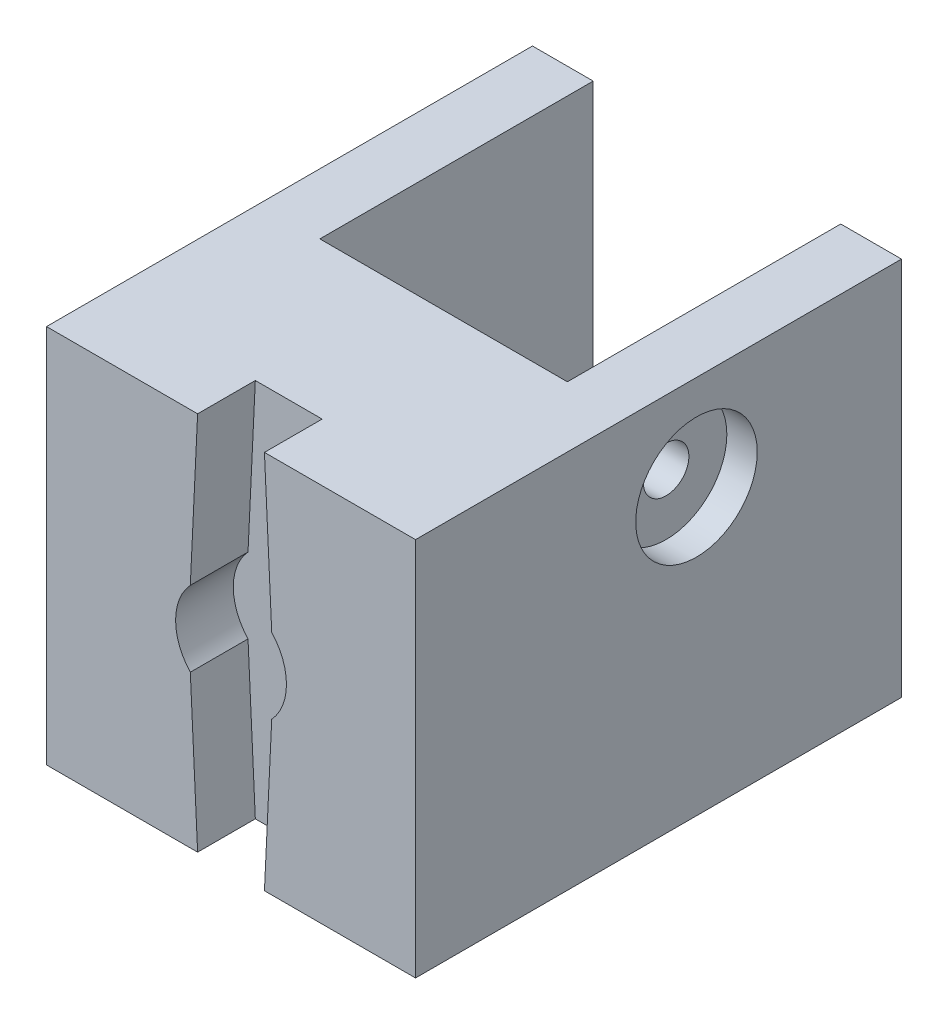
ISO-10303-21;
HEADER;
FILE_DESCRIPTION(('STEP AP214'),'2;1');
FILE_NAME('part.step','',(''),(''),'','','');
FILE_SCHEMA(('AUTOMOTIVE_DESIGN { 1 0 10303 214 1 1 1 1 }'));
ENDSEC;
DATA;
#1=APPLICATION_CONTEXT('core data for automotive mechanical design processes');
#2=APPLICATION_PROTOCOL_DEFINITION('international standard','automotive_design',2000,#1);
#3=PRODUCT_CONTEXT('',#1,'mechanical');
#4=PRODUCT('Part','Part','',(#3));
#5=PRODUCT_RELATED_PRODUCT_CATEGORY('part','',(#4));
#6=PRODUCT_DEFINITION_FORMATION('','',#4);
#7=PRODUCT_DEFINITION_CONTEXT('part definition',#1,'design');
#8=PRODUCT_DEFINITION('design','',#6,#7);
#9=PRODUCT_DEFINITION_SHAPE('','',#8);
#10=(LENGTH_UNIT() NAMED_UNIT(*) SI_UNIT(.MILLI.,.METRE.));
#11=(NAMED_UNIT(*) PLANE_ANGLE_UNIT() SI_UNIT($,.RADIAN.));
#12=(NAMED_UNIT(*) SI_UNIT($,.STERADIAN.) SOLID_ANGLE_UNIT());
#13=UNCERTAINTY_MEASURE_WITH_UNIT(LENGTH_MEASURE(1.E-05),#10,'distance_accuracy_value','');
#14=(GEOMETRIC_REPRESENTATION_CONTEXT(3) GLOBAL_UNCERTAINTY_ASSIGNED_CONTEXT((#13)) GLOBAL_UNIT_ASSIGNED_CONTEXT((#10,
#11,#12)) REPRESENTATION_CONTEXT('',''));
#15=CARTESIAN_POINT('',(0.,0.,0.));
#16=DIRECTION('',(0.,0.,1.));
#17=DIRECTION('',(1.,0.,0.));
#18=AXIS2_PLACEMENT_3D('',#15,#16,#17);
#19=CARTESIAN_POINT('',(-12.15,6.25,-13.5));
#20=DIRECTION('',(1.,0.,0.));
#21=DIRECTION('',(0.,0.,-1.));
#22=AXIS2_PLACEMENT_3D('',#19,#20,#21);
#23=CYLINDRICAL_SURFACE('',#22,1.5);
#24=CARTESIAN_POINT('',(-8.15000000000001,6.25,-13.5));
#25=DIRECTION('',(1.,0.,0.));
#26=DIRECTION('',(0.,0.,-1.));
#27=AXIS2_PLACEMENT_3D('',#24,#25,#26);
#28=CIRCLE('',#27,1.5);
#29=CARTESIAN_POINT('',(-8.15000000000001,6.25,-15.));
#30=VERTEX_POINT('',#29);
#31=EDGE_CURVE('E191',#30,#30,#28,.T.);
#32=ORIENTED_EDGE('',*,*,#31,.T.);
#33=EDGE_LOOP('',(#32));
#34=FACE_BOUND('',#33,.T.);
#35=CARTESIAN_POINT('',(-10.15,6.25,-13.5));
#36=DIRECTION('',(-1.,0.,0.));
#37=DIRECTION('',(0.,0.,1.));
#38=AXIS2_PLACEMENT_3D('',#35,#36,#37);
#39=CIRCLE('',#38,1.5);
#40=CARTESIAN_POINT('',(-10.15,6.25,-12.));
#41=VERTEX_POINT('',#40);
#42=EDGE_CURVE('E43',#41,#41,#39,.F.);
#43=ORIENTED_EDGE('',*,*,#42,.F.);
#44=EDGE_LOOP('',(#43));
#45=FACE_BOUND('',#44,.T.);
#46=ADVANCED_FACE('F39',(#34,#45),#23,.F.);
#47=CARTESIAN_POINT('',(12.15,18.75,-4.5));
#48=DIRECTION('',(-1.,0.,0.));
#49=DIRECTION('',(0.,0.,1.));
#50=AXIS2_PLACEMENT_3D('',#47,#48,#49);
#51=CYLINDRICAL_SURFACE('',#50,1.5);
#52=CARTESIAN_POINT('',(8.15,18.75,-4.5));
#53=DIRECTION('',(-1.,0.,0.));
#54=DIRECTION('',(0.,0.,1.));
#55=AXIS2_PLACEMENT_3D('',#52,#53,#54);
#56=CIRCLE('',#55,1.5);
#57=CARTESIAN_POINT('',(8.15,18.75,-3.));
#58=VERTEX_POINT('',#57);
#59=EDGE_CURVE('E198',#58,#58,#56,.T.);
#60=ORIENTED_EDGE('',*,*,#59,.T.);
#61=EDGE_LOOP('',(#60));
#62=FACE_BOUND('',#61,.T.);
#63=CARTESIAN_POINT('',(10.15,18.75,-4.5));
#64=DIRECTION('',(1.,0.,0.));
#65=DIRECTION('',(0.,0.,-1.));
#66=AXIS2_PLACEMENT_3D('',#63,#64,#65);
#67=CIRCLE('',#66,1.5);
#68=CARTESIAN_POINT('',(10.15,18.75,-5.99999999999999));
#69=VERTEX_POINT('',#68);
#70=EDGE_CURVE('E188',#69,#69,#67,.F.);
#71=ORIENTED_EDGE('',*,*,#70,.F.);
#72=EDGE_LOOP('',(#71));
#73=FACE_BOUND('',#72,.T.);
#74=ADVANCED_FACE('F411',(#62,#73),#51,.F.);
#75=CARTESIAN_POINT('',(0.,0.,14.));
#76=DIRECTION('',(0.,0.,1.));
#77=DIRECTION('',(1.,0.,0.));
#78=AXIS2_PLACEMENT_3D('',#75,#76,#77);
#79=PLANE('',#78);
#80=CARTESIAN_POINT('',(0.,12.5,14.));
#81=DIRECTION('',(0.,0.,1.));
#82=DIRECTION('',(1.,0.,0.));
#83=AXIS2_PLACEMENT_3D('',#80,#81,#82);
#84=CIRCLE('',#83,3.65);
#85=CARTESIAN_POINT('',(2.68111777409015,10.0232869602116,14.));
#86=VERTEX_POINT('',#85);
#87=CARTESIAN_POINT('',(2.68111777409015,14.9767130397884,14.));
#88=VERTEX_POINT('',#87);
#89=EDGE_CURVE('E215',#86,#88,#84,.T.);
#90=ORIENTED_EDGE('',*,*,#89,.F.);
#91=DIRECTION('',(0.0479447993683979,0.99884998684163,0.));
#92=VECTOR('',#91,1.);
#93=CARTESIAN_POINT('',(2.2,0.,14.));
#94=LINE('',#93,#92);
#95=CARTESIAN_POINT('',(2.2,0.,14.));
#96=VERTEX_POINT('',#95);
#97=EDGE_CURVE('E261',#96,#86,#94,.T.);
#98=ORIENTED_EDGE('',*,*,#97,.F.);
#99=DIRECTION('',(1.,0.,0.));
#100=VECTOR('',#99,1.);
#101=CARTESIAN_POINT('',(-12.15,0.,14.));
#102=LINE('',#101,#100);
#103=CARTESIAN_POINT('',(12.15,0.,14.));
#104=VERTEX_POINT('',#103);
#105=EDGE_CURVE('E289',#96,#104,#102,.T.);
#106=ORIENTED_EDGE('',*,*,#105,.T.);
#107=DIRECTION('',(0.,1.,0.));
#108=VECTOR('',#107,1.);
#109=CARTESIAN_POINT('',(12.15,0.,14.));
#110=LINE('',#109,#108);
#111=CARTESIAN_POINT('',(12.15,25.,14.));
#112=VERTEX_POINT('',#111);
#113=EDGE_CURVE('E294',#104,#112,#110,.T.);
#114=ORIENTED_EDGE('',*,*,#113,.T.);
#115=DIRECTION('',(-1.,0.,0.));
#116=VECTOR('',#115,1.);
#117=CARTESIAN_POINT('',(12.15,25.,14.));
#118=LINE('',#117,#116);
#119=CARTESIAN_POINT('',(2.2,25.,14.));
#120=VERTEX_POINT('',#119);
#121=EDGE_CURVE('E154',#112,#120,#118,.T.);
#122=ORIENTED_EDGE('',*,*,#121,.T.);
#123=DIRECTION('',(-0.0479447993683979,0.99884998684163,0.));
#124=VECTOR('',#123,1.);
#125=CARTESIAN_POINT('',(2.2,25.,14.));
#126=LINE('',#125,#124);
#127=EDGE_CURVE('E243',#88,#120,#126,.T.);
#128=ORIENTED_EDGE('',*,*,#127,.F.);
#129=EDGE_LOOP('',(#90,#98,#106,#114,#122,#128));
#130=FACE_BOUND('',#129,.T.);
#131=ADVANCED_FACE('F342',(#130),#79,.T.);
#132=CARTESIAN_POINT('',(12.15,25.,0.));
#133=DIRECTION('',(-1.,0.,0.));
#134=DIRECTION('',(0.,0.,1.));
#135=AXIS2_PLACEMENT_3D('',#132,#133,#134);
#136=PLANE('',#135);
#137=CARTESIAN_POINT('',(12.15,18.75,-4.5));
#138=DIRECTION('',(1.,0.,0.));
#139=DIRECTION('',(0.,0.,-1.));
#140=AXIS2_PLACEMENT_3D('',#137,#138,#139);
#141=CIRCLE('',#140,4.);
#142=CARTESIAN_POINT('',(12.15,18.75,-8.5));
#143=VERTEX_POINT('',#142);
#144=EDGE_CURVE('E201',#143,#143,#141,.T.);
#145=ORIENTED_EDGE('',*,*,#144,.F.);
#146=EDGE_LOOP('',(#145));
#147=FACE_BOUND('',#146,.T.);
#148=DIRECTION('',(0.,0.,-1.));
#149=VECTOR('',#148,1.);
#150=CARTESIAN_POINT('',(12.15,0.,0.));
#151=LINE('',#150,#149);
#152=CARTESIAN_POINT('',(12.15,0.,-18.));
#153=VERTEX_POINT('',#152);
#154=EDGE_CURVE('E149',#104,#153,#151,.T.);
#155=ORIENTED_EDGE('',*,*,#154,.T.);
#156=DIRECTION('',(0.,-1.,0.));
#157=VECTOR('',#156,1.);
#158=CARTESIAN_POINT('',(12.15,25.,-18.));
#159=LINE('',#158,#157);
#160=CARTESIAN_POINT('',(12.15,25.,-18.));
#161=VERTEX_POINT('',#160);
#162=EDGE_CURVE('E183',#161,#153,#159,.T.);
#163=ORIENTED_EDGE('',*,*,#162,.F.);
#164=DIRECTION('',(0.,0.,-1.));
#165=VECTOR('',#164,1.);
#166=CARTESIAN_POINT('',(12.15,25.,0.));
#167=LINE('',#166,#165);
#168=EDGE_CURVE('E100',#112,#161,#167,.T.);
#169=ORIENTED_EDGE('',*,*,#168,.F.);
#170=ORIENTED_EDGE('',*,*,#113,.F.);
#171=EDGE_LOOP('',(#155,#163,#169,#170));
#172=FACE_BOUND('',#171,.T.);
#173=ADVANCED_FACE('F41',(#147,#172),#136,.F.);
#174=CARTESIAN_POINT('',(8.15,25.,-18.));
#175=DIRECTION('',(0.,0.,-1.));
#176=DIRECTION('',(-1.,0.,0.));
#177=AXIS2_PLACEMENT_3D('',#174,#175,#176);
#178=PLANE('',#177);
#179=DIRECTION('',(1.,0.,0.));
#180=VECTOR('',#179,1.);
#181=CARTESIAN_POINT('',(8.15,0.,-18.));
#182=LINE('',#181,#180);
#183=CARTESIAN_POINT('',(8.15,0.,-18.));
#184=VERTEX_POINT('',#183);
#185=EDGE_CURVE('E153',#184,#153,#182,.T.);
#186=ORIENTED_EDGE('',*,*,#185,.F.);
#187=DIRECTION('',(0.,-1.,0.));
#188=VECTOR('',#187,1.);
#189=CARTESIAN_POINT('',(8.15,25.,-18.));
#190=LINE('',#189,#188);
#191=CARTESIAN_POINT('',(8.15,25.,-18.));
#192=VERTEX_POINT('',#191);
#193=EDGE_CURVE('E180',#192,#184,#190,.T.);
#194=ORIENTED_EDGE('',*,*,#193,.F.);
#195=DIRECTION('',(1.,0.,0.));
#196=VECTOR('',#195,1.);
#197=CARTESIAN_POINT('',(8.15,25.,-18.));
#198=LINE('',#197,#196);
#199=EDGE_CURVE('E304',#192,#161,#198,.T.);
#200=ORIENTED_EDGE('',*,*,#199,.T.);
#201=ORIENTED_EDGE('',*,*,#162,.T.);
#202=EDGE_LOOP('',(#186,#194,#200,#201));
#203=FACE_BOUND('',#202,.T.);
#204=ADVANCED_FACE('F467',(#203),#178,.T.);
#205=CARTESIAN_POINT('',(8.15,25.,0.));
#206=DIRECTION('',(-1.,0.,0.));
#207=DIRECTION('',(0.,0.,1.));
#208=AXIS2_PLACEMENT_3D('',#205,#206,#207);
#209=PLANE('',#208);
#210=ORIENTED_EDGE('',*,*,#59,.F.);
#211=EDGE_LOOP('',(#210));
#212=FACE_BOUND('',#211,.T.);
#213=DIRECTION('',(0.,0.,-1.));
#214=VECTOR('',#213,1.);
#215=CARTESIAN_POINT('',(8.15,0.,0.));
#216=LINE('',#215,#214);
#217=CARTESIAN_POINT('',(8.15,0.,0.));
#218=VERTEX_POINT('',#217);
#219=EDGE_CURVE('E158',#218,#184,#216,.T.);
#220=ORIENTED_EDGE('',*,*,#219,.F.);
#221=DIRECTION('',(0.,-1.,0.));
#222=VECTOR('',#221,1.);
#223=CARTESIAN_POINT('',(8.15,25.,0.));
#224=LINE('',#223,#222);
#225=CARTESIAN_POINT('',(8.15,25.,0.));
#226=VERTEX_POINT('',#225);
#227=EDGE_CURVE('E124',#226,#218,#224,.T.);
#228=ORIENTED_EDGE('',*,*,#227,.F.);
#229=DIRECTION('',(0.,0.,-1.));
#230=VECTOR('',#229,1.);
#231=CARTESIAN_POINT('',(8.15,25.,0.));
#232=LINE('',#231,#230);
#233=EDGE_CURVE('E134',#226,#192,#232,.T.);
#234=ORIENTED_EDGE('',*,*,#233,.T.);
#235=ORIENTED_EDGE('',*,*,#193,.T.);
#236=EDGE_LOOP('',(#220,#228,#234,#235));
#237=FACE_BOUND('',#236,.T.);
#238=ADVANCED_FACE('F310',(#212,#237),#209,.T.);
#239=CARTESIAN_POINT('',(-8.15,25.,0.));
#240=DIRECTION('',(0.,0.,-1.));
#241=DIRECTION('',(-1.,0.,0.));
#242=AXIS2_PLACEMENT_3D('',#239,#240,#241);
#243=PLANE('',#242);
#244=DIRECTION('',(1.,0.,0.));
#245=VECTOR('',#244,1.);
#246=CARTESIAN_POINT('',(-8.15,0.,0.));
#247=LINE('',#246,#245);
#248=CARTESIAN_POINT('',(-8.15,0.,0.));
#249=VERTEX_POINT('',#248);
#250=EDGE_CURVE('E118',#249,#218,#247,.T.);
#251=ORIENTED_EDGE('',*,*,#250,.F.);
#252=DIRECTION('',(0.,-1.,0.));
#253=VECTOR('',#252,1.);
#254=CARTESIAN_POINT('',(-8.15,25.,0.));
#255=LINE('',#254,#253);
#256=CARTESIAN_POINT('',(-8.15,25.,0.));
#257=VERTEX_POINT('',#256);
#258=EDGE_CURVE('E113',#257,#249,#255,.T.);
#259=ORIENTED_EDGE('',*,*,#258,.F.);
#260=DIRECTION('',(1.,0.,0.));
#261=VECTOR('',#260,1.);
#262=CARTESIAN_POINT('',(-8.15,25.,0.));
#263=LINE('',#262,#261);
#264=EDGE_CURVE('E116',#257,#226,#263,.T.);
#265=ORIENTED_EDGE('',*,*,#264,.T.);
#266=ORIENTED_EDGE('',*,*,#227,.T.);
#267=EDGE_LOOP('',(#251,#259,#265,#266));
#268=FACE_BOUND('',#267,.T.);
#269=ADVANCED_FACE('F115',(#268),#243,.T.);
#270=CARTESIAN_POINT('',(-8.15000000000001,25.,-18.));
#271=DIRECTION('',(1.,0.,0.));
#272=DIRECTION('',(0.,0.,-1.));
#273=AXIS2_PLACEMENT_3D('',#270,#271,#272);
#274=PLANE('',#273);
#275=ORIENTED_EDGE('',*,*,#31,.F.);
#276=EDGE_LOOP('',(#275));
#277=FACE_BOUND('',#276,.T.);
#278=DIRECTION('',(0.,0.,1.));
#279=VECTOR('',#278,1.);
#280=CARTESIAN_POINT('',(-8.15000000000001,0.,-18.));
#281=LINE('',#280,#279);
#282=CARTESIAN_POINT('',(-8.15000000000001,0.,-18.));
#283=VERTEX_POINT('',#282);
#284=EDGE_CURVE('E164',#283,#249,#281,.T.);
#285=ORIENTED_EDGE('',*,*,#284,.F.);
#286=DIRECTION('',(0.,-1.,0.));
#287=VECTOR('',#286,1.);
#288=CARTESIAN_POINT('',(-8.15000000000001,25.,-18.));
#289=LINE('',#288,#287);
#290=CARTESIAN_POINT('',(-8.15000000000001,25.,-18.));
#291=VERTEX_POINT('',#290);
#292=EDGE_CURVE('E125',#291,#283,#289,.T.);
#293=ORIENTED_EDGE('',*,*,#292,.F.);
#294=DIRECTION('',(0.,0.,1.));
#295=VECTOR('',#294,1.);
#296=CARTESIAN_POINT('',(-8.15000000000001,25.,-18.));
#297=LINE('',#296,#295);
#298=EDGE_CURVE('E132',#291,#257,#297,.T.);
#299=ORIENTED_EDGE('',*,*,#298,.T.);
#300=ORIENTED_EDGE('',*,*,#258,.T.);
#301=EDGE_LOOP('',(#285,#293,#299,#300));
#302=FACE_BOUND('',#301,.T.);
#303=ADVANCED_FACE('F137',(#277,#302),#274,.T.);
#304=CARTESIAN_POINT('',(-12.15,25.,-18.));
#305=DIRECTION('',(0.,0.,-1.));
#306=DIRECTION('',(-1.,0.,0.));
#307=AXIS2_PLACEMENT_3D('',#304,#305,#306);
#308=PLANE('',#307);
#309=DIRECTION('',(1.,0.,0.));
#310=VECTOR('',#309,1.);
#311=CARTESIAN_POINT('',(-12.15,0.,-18.));
#312=LINE('',#311,#310);
#313=CARTESIAN_POINT('',(-12.15,0.,-18.));
#314=VERTEX_POINT('',#313);
#315=EDGE_CURVE('E167',#314,#283,#312,.T.);
#316=ORIENTED_EDGE('',*,*,#315,.F.);
#317=DIRECTION('',(0.,-1.,0.));
#318=VECTOR('',#317,1.);
#319=CARTESIAN_POINT('',(-12.15,25.,-18.));
#320=LINE('',#319,#318);
#321=CARTESIAN_POINT('',(-12.15,25.,-18.));
#322=VERTEX_POINT('',#321);
#323=EDGE_CURVE('E66',#322,#314,#320,.T.);
#324=ORIENTED_EDGE('',*,*,#323,.F.);
#325=DIRECTION('',(1.,0.,0.));
#326=VECTOR('',#325,1.);
#327=CARTESIAN_POINT('',(-12.15,25.,-18.));
#328=LINE('',#327,#326);
#329=EDGE_CURVE('E139',#322,#291,#328,.T.);
#330=ORIENTED_EDGE('',*,*,#329,.T.);
#331=ORIENTED_EDGE('',*,*,#292,.T.);
#332=EDGE_LOOP('',(#316,#324,#330,#331));
#333=FACE_BOUND('',#332,.T.);
#334=ADVANCED_FACE('F316',(#333),#308,.T.);
#335=CARTESIAN_POINT('',(-12.15,25.,-18.));
#336=DIRECTION('',(1.,0.,0.));
#337=DIRECTION('',(0.,0.,-1.));
#338=AXIS2_PLACEMENT_3D('',#335,#336,#337);
#339=PLANE('',#338);
#340=CARTESIAN_POINT('',(-12.15,6.25,-13.5));
#341=DIRECTION('',(-1.,0.,0.));
#342=DIRECTION('',(0.,0.,1.));
#343=AXIS2_PLACEMENT_3D('',#340,#341,#342);
#344=CIRCLE('',#343,4.);
#345=CARTESIAN_POINT('',(-12.15,6.25,-9.49999999999999));
#346=VERTEX_POINT('',#345);
#347=EDGE_CURVE('E209',#346,#346,#344,.T.);
#348=ORIENTED_EDGE('',*,*,#347,.F.);
#349=EDGE_LOOP('',(#348));
#350=FACE_BOUND('',#349,.T.);
#351=DIRECTION('',(0.,0.,1.));
#352=VECTOR('',#351,1.);
#353=CARTESIAN_POINT('',(-12.15,0.,-18.));
#354=LINE('',#353,#352);
#355=CARTESIAN_POINT('',(-12.15,0.,14.));
#356=VERTEX_POINT('',#355);
#357=EDGE_CURVE('E171',#314,#356,#354,.T.);
#358=ORIENTED_EDGE('',*,*,#357,.T.);
#359=DIRECTION('',(0.,-1.,0.));
#360=VECTOR('',#359,1.);
#361=CARTESIAN_POINT('',(-12.15,25.,14.));
#362=LINE('',#361,#360);
#363=CARTESIAN_POINT('',(-12.15,25.,14.));
#364=VERTEX_POINT('',#363);
#365=EDGE_CURVE('E285',#364,#356,#362,.T.);
#366=ORIENTED_EDGE('',*,*,#365,.F.);
#367=DIRECTION('',(0.,0.,1.));
#368=VECTOR('',#367,1.);
#369=CARTESIAN_POINT('',(-12.15,25.,-18.));
#370=LINE('',#369,#368);
#371=EDGE_CURVE('E142',#322,#364,#370,.T.);
#372=ORIENTED_EDGE('',*,*,#371,.F.);
#373=ORIENTED_EDGE('',*,*,#323,.T.);
#374=EDGE_LOOP('',(#358,#366,#372,#373));
#375=FACE_BOUND('',#374,.T.);
#376=ADVANCED_FACE('F321',(#350,#375),#339,.F.);
#377=CARTESIAN_POINT('',(0.,25.,0.));
#378=DIRECTION('',(0.,-1.,0.));
#379=DIRECTION('',(-1.,0.,0.));
#380=AXIS2_PLACEMENT_3D('',#377,#378,#379);
#381=PLANE('',#380);
#382=DIRECTION('',(1.,0.,0.));
#383=VECTOR('',#382,1.);
#384=CARTESIAN_POINT('',(0.,25.,10.2));
#385=LINE('',#384,#383);
#386=CARTESIAN_POINT('',(-2.2,25.,10.2));
#387=VERTEX_POINT('',#386);
#388=CARTESIAN_POINT('',(2.2,25.,10.2));
#389=VERTEX_POINT('',#388);
#390=EDGE_CURVE('E272',#387,#389,#385,.T.);
#391=ORIENTED_EDGE('',*,*,#390,.T.);
#392=DIRECTION('',(0.,0.,1.));
#393=VECTOR('',#392,1.);
#394=CARTESIAN_POINT('',(2.2,25.,10.2));
#395=LINE('',#394,#393);
#396=EDGE_CURVE('E268',#389,#120,#395,.T.);
#397=ORIENTED_EDGE('',*,*,#396,.T.);
#398=ORIENTED_EDGE('',*,*,#121,.F.);
#399=ORIENTED_EDGE('',*,*,#168,.T.);
#400=ORIENTED_EDGE('',*,*,#199,.F.);
#401=ORIENTED_EDGE('',*,*,#233,.F.);
#402=ORIENTED_EDGE('',*,*,#264,.F.);
#403=ORIENTED_EDGE('',*,*,#298,.F.);
#404=ORIENTED_EDGE('',*,*,#329,.F.);
#405=ORIENTED_EDGE('',*,*,#371,.T.);
#406=CARTESIAN_POINT('',(-2.2,25.,14.));
#407=VERTEX_POINT('',#406);
#408=EDGE_CURVE('E298',#407,#364,#118,.T.);
#409=ORIENTED_EDGE('',*,*,#408,.F.);
#410=DIRECTION('',(0.,0.,1.));
#411=VECTOR('',#410,1.);
#412=CARTESIAN_POINT('',(-2.2,25.,10.2));
#413=LINE('',#412,#411);
#414=EDGE_CURVE('E57',#387,#407,#413,.T.);
#415=ORIENTED_EDGE('',*,*,#414,.F.);
#416=EDGE_LOOP('',(#391,#397,#398,#399,#400,#401,#402,#403,#404,#405,#409,#415));
#417=FACE_BOUND('',#416,.T.);
#418=ADVANCED_FACE('F130',(#417),#381,.F.);
#419=CARTESIAN_POINT('',(0.,0.,0.));
#420=DIRECTION('',(0.,-1.,0.));
#421=DIRECTION('',(-1.,0.,0.));
#422=AXIS2_PLACEMENT_3D('',#419,#420,#421);
#423=PLANE('',#422);
#424=DIRECTION('',(0.,0.,1.));
#425=VECTOR('',#424,1.);
#426=CARTESIAN_POINT('',(2.2,0.,10.2));
#427=LINE('',#426,#425);
#428=CARTESIAN_POINT('',(2.2,0.,10.2));
#429=VERTEX_POINT('',#428);
#430=EDGE_CURVE('E273',#429,#96,#427,.T.);
#431=ORIENTED_EDGE('',*,*,#430,.F.);
#432=DIRECTION('',(1.,0.,0.));
#433=VECTOR('',#432,1.);
#434=CARTESIAN_POINT('',(0.,0.,10.2));
#435=LINE('',#434,#433);
#436=CARTESIAN_POINT('',(-2.2,0.,10.2));
#437=VERTEX_POINT('',#436);
#438=EDGE_CURVE('E49',#437,#429,#435,.T.);
#439=ORIENTED_EDGE('',*,*,#438,.F.);
#440=DIRECTION('',(0.,0.,1.));
#441=VECTOR('',#440,1.);
#442=CARTESIAN_POINT('',(-2.2,0.,10.2));
#443=LINE('',#442,#441);
#444=CARTESIAN_POINT('',(-2.2,0.,14.));
#445=VERTEX_POINT('',#444);
#446=EDGE_CURVE('E277',#437,#445,#443,.T.);
#447=ORIENTED_EDGE('',*,*,#446,.T.);
#448=EDGE_CURVE('E290',#356,#445,#102,.T.);
#449=ORIENTED_EDGE('',*,*,#448,.F.);
#450=ORIENTED_EDGE('',*,*,#357,.F.);
#451=ORIENTED_EDGE('',*,*,#315,.T.);
#452=ORIENTED_EDGE('',*,*,#284,.T.);
#453=ORIENTED_EDGE('',*,*,#250,.T.);
#454=ORIENTED_EDGE('',*,*,#219,.T.);
#455=ORIENTED_EDGE('',*,*,#185,.T.);
#456=ORIENTED_EDGE('',*,*,#154,.F.);
#457=ORIENTED_EDGE('',*,*,#105,.F.);
#458=EDGE_LOOP('',(#431,#439,#447,#449,#450,#451,#452,#453,#454,#455,#456,#457));
#459=FACE_BOUND('',#458,.T.);
#460=ADVANCED_FACE('F314',(#459),#423,.T.);
#461=CARTESIAN_POINT('',(-2.68111777409016,14.9767130397884,14.));
#462=VERTEX_POINT('',#461);
#463=CARTESIAN_POINT('',(-2.68111777409016,10.0232869602116,14.));
#464=VERTEX_POINT('',#463);
#465=EDGE_CURVE('E221',#462,#464,#84,.T.);
#466=ORIENTED_EDGE('',*,*,#465,.F.);
#467=DIRECTION('',(-0.0479447993683981,-0.99884998684163,0.));
#468=VECTOR('',#467,1.);
#469=CARTESIAN_POINT('',(-2.2,25.,14.));
#470=LINE('',#469,#468);
#471=EDGE_CURVE('E237',#407,#462,#470,.T.);
#472=ORIENTED_EDGE('',*,*,#471,.F.);
#473=ORIENTED_EDGE('',*,*,#408,.T.);
#474=ORIENTED_EDGE('',*,*,#365,.T.);
#475=ORIENTED_EDGE('',*,*,#448,.T.);
#476=DIRECTION('',(0.0479447993683981,-0.99884998684163,0.));
#477=VECTOR('',#476,1.);
#478=CARTESIAN_POINT('',(-2.2,0.,14.));
#479=LINE('',#478,#477);
#480=EDGE_CURVE('E257',#464,#445,#479,.T.);
#481=ORIENTED_EDGE('',*,*,#480,.F.);
#482=EDGE_LOOP('',(#466,#472,#473,#474,#475,#481));
#483=FACE_BOUND('',#482,.T.);
#484=ADVANCED_FACE('F325',(#483),#79,.T.);
#485=CARTESIAN_POINT('',(0.,24.8944,10.2));
#486=DIRECTION('',(0.,0.,-1.));
#487=DIRECTION('',(-1.,0.,0.));
#488=AXIS2_PLACEMENT_3D('',#485,#486,#487);
#489=PLANE('',#488);
#490=DIRECTION('',(0.0479447993683979,0.99884998684163,0.));
#491=VECTOR('',#490,1.);
#492=CARTESIAN_POINT('',(2.2,0.,10.2));
#493=LINE('',#492,#491);
#494=CARTESIAN_POINT('',(2.68111777409015,10.0232869602116,10.2));
#495=VERTEX_POINT('',#494);
#496=EDGE_CURVE('E247',#429,#495,#493,.T.);
#497=ORIENTED_EDGE('',*,*,#496,.T.);
#498=CARTESIAN_POINT('',(0.,12.5,10.2));
#499=DIRECTION('',(0.,0.,1.));
#500=DIRECTION('',(1.,0.,0.));
#501=AXIS2_PLACEMENT_3D('',#498,#499,#500);
#502=CIRCLE('',#501,3.65);
#503=CARTESIAN_POINT('',(2.68111777409015,14.9767130397884,10.2));
#504=VERTEX_POINT('',#503);
#505=EDGE_CURVE('E216',#495,#504,#502,.T.);
#506=ORIENTED_EDGE('',*,*,#505,.T.);
#507=DIRECTION('',(-0.0479447993683979,0.99884998684163,0.));
#508=VECTOR('',#507,1.);
#509=CARTESIAN_POINT('',(2.2,25.,10.2));
#510=LINE('',#509,#508);
#511=EDGE_CURVE('E251',#504,#389,#510,.T.);
#512=ORIENTED_EDGE('',*,*,#511,.T.);
#513=ORIENTED_EDGE('',*,*,#390,.F.);
#514=DIRECTION('',(-0.0479447993683981,-0.99884998684163,0.));
#515=VECTOR('',#514,1.);
#516=CARTESIAN_POINT('',(-2.2,25.,10.2));
#517=LINE('',#516,#515);
#518=CARTESIAN_POINT('',(-2.68111777409016,14.9767130397884,10.2));
#519=VERTEX_POINT('',#518);
#520=EDGE_CURVE('E238',#387,#519,#517,.T.);
#521=ORIENTED_EDGE('',*,*,#520,.T.);
#522=CARTESIAN_POINT('',(-2.68111777409016,10.0232869602116,10.2));
#523=VERTEX_POINT('',#522);
#524=EDGE_CURVE('E220',#519,#523,#502,.T.);
#525=ORIENTED_EDGE('',*,*,#524,.T.);
#526=DIRECTION('',(0.0479447993683981,-0.99884998684163,0.));
#527=VECTOR('',#526,1.);
#528=CARTESIAN_POINT('',(-2.2,0.,10.2));
#529=LINE('',#528,#527);
#530=EDGE_CURVE('E242',#523,#437,#529,.T.);
#531=ORIENTED_EDGE('',*,*,#530,.T.);
#532=ORIENTED_EDGE('',*,*,#438,.T.);
#533=EDGE_LOOP('',(#497,#506,#512,#513,#521,#525,#531,#532));
#534=FACE_BOUND('',#533,.T.);
#535=ADVANCED_FACE('F398',(#534),#489,.F.);
#536=CARTESIAN_POINT('',(2.2,25.,10.2));
#537=DIRECTION('',(0.99884998684163,0.0479447993683979,0.));
#538=DIRECTION('',(-0.0479447993683979,0.99884998684163,0.));
#539=AXIS2_PLACEMENT_3D('',#536,#537,#538);
#540=PLANE('',#539);
#541=ORIENTED_EDGE('',*,*,#511,.F.);
#542=DIRECTION('',(0.,0.,1.));
#543=VECTOR('',#542,1.);
#544=CARTESIAN_POINT('',(2.68111777409016,14.9767130397884,10.2));
#545=LINE('',#544,#543);
#546=EDGE_CURVE('E233',#504,#88,#545,.T.);
#547=ORIENTED_EDGE('',*,*,#546,.T.);
#548=ORIENTED_EDGE('',*,*,#127,.T.);
#549=ORIENTED_EDGE('',*,*,#396,.F.);
#550=EDGE_LOOP('',(#541,#547,#548,#549));
#551=FACE_BOUND('',#550,.T.);
#552=ADVANCED_FACE('F353',(#551),#540,.F.);
#553=CARTESIAN_POINT('',(2.2,0.,10.2));
#554=DIRECTION('',(0.99884998684163,-0.0479447993683979,0.));
#555=DIRECTION('',(0.0479447993683979,0.99884998684163,0.));
#556=AXIS2_PLACEMENT_3D('',#553,#554,#555);
#557=PLANE('',#556);
#558=ORIENTED_EDGE('',*,*,#97,.T.);
#559=DIRECTION('',(0.,0.,1.));
#560=VECTOR('',#559,1.);
#561=CARTESIAN_POINT('',(2.68111777409015,10.0232869602116,10.2));
#562=LINE('',#561,#560);
#563=EDGE_CURVE('E229',#86,#495,#562,.F.);
#564=ORIENTED_EDGE('',*,*,#563,.T.);
#565=ORIENTED_EDGE('',*,*,#496,.F.);
#566=ORIENTED_EDGE('',*,*,#430,.T.);
#567=EDGE_LOOP('',(#558,#564,#565,#566));
#568=FACE_BOUND('',#567,.T.);
#569=ADVANCED_FACE('F385',(#568),#557,.F.);
#570=CARTESIAN_POINT('',(-2.2,0.,10.2));
#571=DIRECTION('',(-0.99884998684163,-0.0479447993683981,0.));
#572=DIRECTION('',(0.0479447993683981,-0.99884998684163,0.));
#573=AXIS2_PLACEMENT_3D('',#570,#571,#572);
#574=PLANE('',#573);
#575=ORIENTED_EDGE('',*,*,#530,.F.);
#576=DIRECTION('',(0.,0.,1.));
#577=VECTOR('',#576,1.);
#578=CARTESIAN_POINT('',(-2.68111777409016,10.0232869602116,10.2));
#579=LINE('',#578,#577);
#580=EDGE_CURVE('E225',#523,#464,#579,.T.);
#581=ORIENTED_EDGE('',*,*,#580,.T.);
#582=ORIENTED_EDGE('',*,*,#480,.T.);
#583=ORIENTED_EDGE('',*,*,#446,.F.);
#584=EDGE_LOOP('',(#575,#581,#582,#583));
#585=FACE_BOUND('',#584,.T.);
#586=ADVANCED_FACE('F395',(#585),#574,.F.);
#587=CARTESIAN_POINT('',(-2.2,25.,10.2));
#588=DIRECTION('',(-0.99884998684163,0.0479447993683981,0.));
#589=DIRECTION('',(-0.0479447993683981,-0.99884998684163,0.));
#590=AXIS2_PLACEMENT_3D('',#587,#588,#589);
#591=PLANE('',#590);
#592=ORIENTED_EDGE('',*,*,#471,.T.);
#593=DIRECTION('',(0.,0.,1.));
#594=VECTOR('',#593,1.);
#595=CARTESIAN_POINT('',(-2.68111777409016,14.9767130397884,10.2));
#596=LINE('',#595,#594);
#597=EDGE_CURVE('E11',#462,#519,#596,.F.);
#598=ORIENTED_EDGE('',*,*,#597,.T.);
#599=ORIENTED_EDGE('',*,*,#520,.F.);
#600=ORIENTED_EDGE('',*,*,#414,.T.);
#601=EDGE_LOOP('',(#592,#598,#599,#600));
#602=FACE_BOUND('',#601,.T.);
#603=ADVANCED_FACE('F399',(#602),#591,.F.);
#604=CARTESIAN_POINT('',(0.,12.5,10.2));
#605=DIRECTION('',(0.,0.,1.));
#606=DIRECTION('',(1.,0.,0.));
#607=AXIS2_PLACEMENT_3D('',#604,#605,#606);
#608=CYLINDRICAL_SURFACE('',#607,3.65);
#609=ORIENTED_EDGE('',*,*,#524,.F.);
#610=ORIENTED_EDGE('',*,*,#597,.F.);
#611=ORIENTED_EDGE('',*,*,#465,.T.);
#612=ORIENTED_EDGE('',*,*,#580,.F.);
#613=EDGE_LOOP('',(#609,#610,#611,#612));
#614=FACE_BOUND('',#613,.T.);
#615=ADVANCED_FACE('F392',(#614),#608,.F.);
#616=ORIENTED_EDGE('',*,*,#505,.F.);
#617=ORIENTED_EDGE('',*,*,#563,.F.);
#618=ORIENTED_EDGE('',*,*,#89,.T.);
#619=ORIENTED_EDGE('',*,*,#546,.F.);
#620=EDGE_LOOP('',(#616,#617,#618,#619));
#621=FACE_BOUND('',#620,.T.);
#622=ADVANCED_FACE('F406',(#621),#608,.F.);
#623=CARTESIAN_POINT('',(10.15,18.75,-4.5));
#624=DIRECTION('',(1.,0.,0.));
#625=DIRECTION('',(0.,0.,-1.));
#626=AXIS2_PLACEMENT_3D('',#623,#624,#625);
#627=PLANE('',#626);
#628=CARTESIAN_POINT('',(10.15,18.75,-4.5));
#629=DIRECTION('',(1.,0.,0.));
#630=DIRECTION('',(0.,0.,-1.));
#631=AXIS2_PLACEMENT_3D('',#628,#629,#630);
#632=CIRCLE('',#631,4.);
#633=CARTESIAN_POINT('',(10.15,18.75,-8.5));
#634=VERTEX_POINT('',#633);
#635=EDGE_CURVE('E192',#634,#634,#632,.T.);
#636=ORIENTED_EDGE('',*,*,#635,.T.);
#637=EDGE_LOOP('',(#636));
#638=FACE_BOUND('',#637,.T.);
#639=ORIENTED_EDGE('',*,*,#70,.T.);
#640=EDGE_LOOP('',(#639));
#641=FACE_BOUND('',#640,.T.);
#642=ADVANCED_FACE('F425',(#638,#641),#627,.T.);
#643=CARTESIAN_POINT('',(10.15,18.75,-4.5));
#644=DIRECTION('',(1.,0.,0.));
#645=DIRECTION('',(0.,0.,-1.));
#646=AXIS2_PLACEMENT_3D('',#643,#644,#645);
#647=CYLINDRICAL_SURFACE('',#646,4.);
#648=ORIENTED_EDGE('',*,*,#635,.F.);
#649=EDGE_LOOP('',(#648));
#650=FACE_BOUND('',#649,.T.);
#651=ORIENTED_EDGE('',*,*,#144,.T.);
#652=EDGE_LOOP('',(#651));
#653=FACE_BOUND('',#652,.T.);
#654=ADVANCED_FACE('F421',(#650,#653),#647,.F.);
#655=CARTESIAN_POINT('',(-10.15,6.25,-13.5));
#656=DIRECTION('',(-1.,0.,0.));
#657=DIRECTION('',(0.,0.,1.));
#658=AXIS2_PLACEMENT_3D('',#655,#656,#657);
#659=PLANE('',#658);
#660=CARTESIAN_POINT('',(-10.15,6.25,-13.5));
#661=DIRECTION('',(-1.,0.,0.));
#662=DIRECTION('',(0.,0.,1.));
#663=AXIS2_PLACEMENT_3D('',#660,#661,#662);
#664=CIRCLE('',#663,4.);
#665=CARTESIAN_POINT('',(-10.15,6.25,-9.49999999999999));
#666=VERTEX_POINT('',#665);
#667=EDGE_CURVE('E556',#666,#666,#664,.T.);
#668=ORIENTED_EDGE('',*,*,#667,.T.);
#669=EDGE_LOOP('',(#668));
#670=FACE_BOUND('',#669,.T.);
#671=ORIENTED_EDGE('',*,*,#42,.T.);
#672=EDGE_LOOP('',(#671));
#673=FACE_BOUND('',#672,.T.);
#674=ADVANCED_FACE('F514',(#670,#673),#659,.T.);
#675=CARTESIAN_POINT('',(-10.15,6.25,-13.5));
#676=DIRECTION('',(-1.,0.,0.));
#677=DIRECTION('',(0.,0.,1.));
#678=AXIS2_PLACEMENT_3D('',#675,#676,#677);
#679=CYLINDRICAL_SURFACE('',#678,4.);
#680=ORIENTED_EDGE('',*,*,#667,.F.);
#681=EDGE_LOOP('',(#680));
#682=FACE_BOUND('',#681,.T.);
#683=ORIENTED_EDGE('',*,*,#347,.T.);
#684=EDGE_LOOP('',(#683));
#685=FACE_BOUND('',#684,.T.);
#686=ADVANCED_FACE('F539',(#682,#685),#679,.F.);
#687=CLOSED_SHELL('',(#46,#74,#131,#173,#204,#238,#269,#303,#334,#376,#418,#460,#484,#535,#552,
#569,#586,#603,#615,#622,#642,#654,#674,#686));
#688=MANIFOLD_SOLID_BREP('B2',#687);
#689=ADVANCED_BREP_SHAPE_REPRESENTATION('',(#18,#688),#14);
#690=SHAPE_DEFINITION_REPRESENTATION(#9,#689);
ENDSEC;
END-ISO-10303-21;
